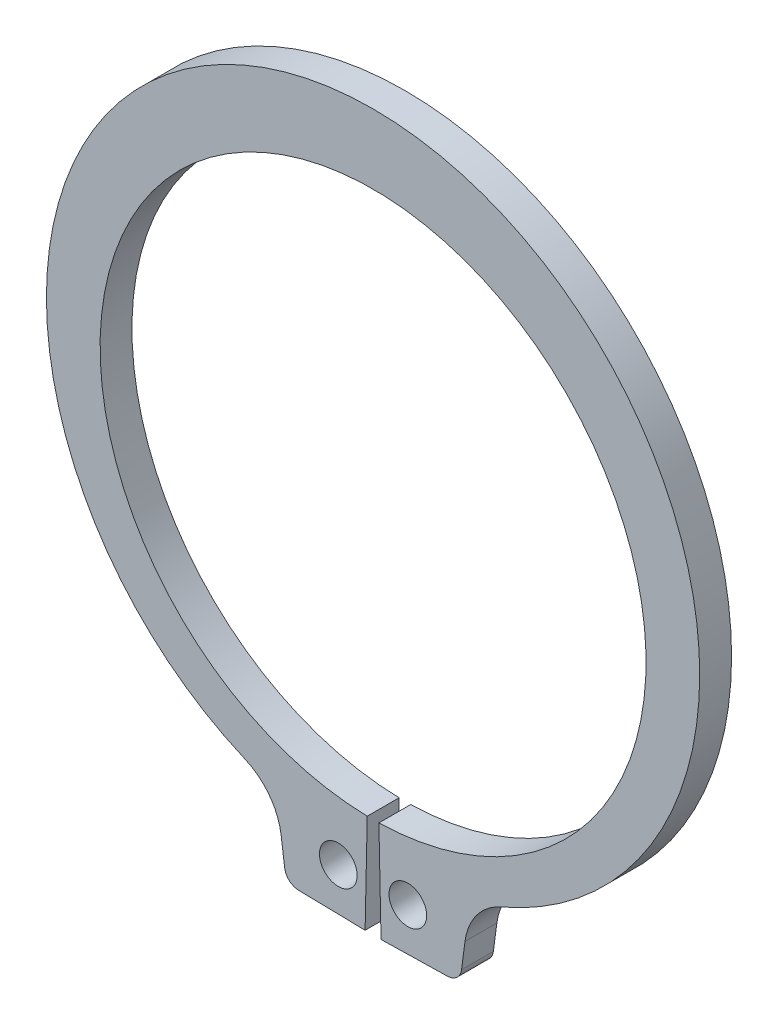
ISO-10303-21;
HEADER;
FILE_DESCRIPTION(('STEP AP214'),'2;1');
FILE_NAME('part.step','',(''),(''),'','','');
FILE_SCHEMA(('AUTOMOTIVE_DESIGN { 1 0 10303 214 1 1 1 1 }'));
ENDSEC;
DATA;
#1=APPLICATION_CONTEXT('core data for automotive mechanical design processes');
#2=APPLICATION_PROTOCOL_DEFINITION('international standard','automotive_design',2000,#1);
#3=PRODUCT_CONTEXT('',#1,'mechanical');
#4=PRODUCT('Part','Part','',(#3));
#5=PRODUCT_RELATED_PRODUCT_CATEGORY('part','',(#4));
#6=PRODUCT_DEFINITION_FORMATION('','',#4);
#7=PRODUCT_DEFINITION_CONTEXT('part definition',#1,'design');
#8=PRODUCT_DEFINITION('design','',#6,#7);
#9=PRODUCT_DEFINITION_SHAPE('','',#8);
#10=(LENGTH_UNIT() NAMED_UNIT(*) SI_UNIT(.MILLI.,.METRE.));
#11=(NAMED_UNIT(*) PLANE_ANGLE_UNIT() SI_UNIT($,.RADIAN.));
#12=(NAMED_UNIT(*) SI_UNIT($,.STERADIAN.) SOLID_ANGLE_UNIT());
#13=UNCERTAINTY_MEASURE_WITH_UNIT(LENGTH_MEASURE(1.E-05),#10,'distance_accuracy_value','');
#14=(GEOMETRIC_REPRESENTATION_CONTEXT(3) GLOBAL_UNCERTAINTY_ASSIGNED_CONTEXT((#13)) GLOBAL_UNIT_ASSIGNED_CONTEXT((#10,
#11,#12)) REPRESENTATION_CONTEXT('',''));
#15=CARTESIAN_POINT('',(0.,0.,0.));
#16=DIRECTION('',(0.,0.,1.));
#17=DIRECTION('',(1.,0.,0.));
#18=AXIS2_PLACEMENT_3D('',#15,#16,#17);
#19=CARTESIAN_POINT('',(0.530667533439555,1.0225945994856,-1.30171469428051));
#20=DIRECTION('',(0.,0.,1.));
#21=DIRECTION('',(1.,0.,0.));
#22=AXIS2_PLACEMENT_3D('',#19,#20,#21);
#23=CYLINDRICAL_SURFACE('',#22,9.425);
#24=CARTESIAN_POINT('',(0.530667533439555,1.0225945994856,-0.201714694280508));
#25=DIRECTION('',(0.,0.,-1.));
#26=DIRECTION('',(1.,0.,0.));
#27=AXIS2_PLACEMENT_3D('',#24,#25,#26);
#28=CIRCLE('',#27,9.425);
#29=CARTESIAN_POINT('',(0.329356853827904,-8.40025523537191,-0.201714694280508));
#30=VERTEX_POINT('',#29);
#31=CARTESIAN_POINT('',(0.731978213051206,-8.40025523537191,-0.201714694280508));
#32=VERTEX_POINT('',#31);
#33=EDGE_CURVE('E137',#30,#32,#28,.T.);
#34=ORIENTED_EDGE('',*,*,#33,.F.);
#35=DIRECTION('',(0.,0.,1.));
#36=VECTOR('',#35,1.);
#37=CARTESIAN_POINT('',(0.329356853827904,-8.40025523537191,-1.30171469428051));
#38=LINE('',#37,#36);
#39=CARTESIAN_POINT('',(0.329356853827904,-8.40025523537191,-1.30171469428051));
#40=VERTEX_POINT('',#39);
#41=EDGE_CURVE('E10',#40,#30,#38,.T.);
#42=ORIENTED_EDGE('',*,*,#41,.F.);
#43=CARTESIAN_POINT('',(0.530667533439555,1.0225945994856,-1.30171469428051));
#44=DIRECTION('',(0.,0.,-1.));
#45=DIRECTION('',(1.,0.,0.));
#46=AXIS2_PLACEMENT_3D('',#43,#44,#45);
#47=CIRCLE('',#46,9.425);
#48=CARTESIAN_POINT('',(0.731978213051206,-8.40025523537191,-1.30171469428051));
#49=VERTEX_POINT('',#48);
#50=EDGE_CURVE('E170',#40,#49,#47,.T.);
#51=ORIENTED_EDGE('',*,*,#50,.T.);
#52=DIRECTION('',(0.,0.,1.));
#53=VECTOR('',#52,1.);
#54=CARTESIAN_POINT('',(0.731978213051206,-8.40025523537191,-1.30171469428051));
#55=LINE('',#54,#53);
#56=EDGE_CURVE('E19',#49,#32,#55,.T.);
#57=ORIENTED_EDGE('',*,*,#56,.T.);
#58=EDGE_LOOP('',(#34,#42,#51,#57));
#59=FACE_BOUND('',#58,.T.);
#60=ADVANCED_FACE('F16',(#59),#23,.F.);
#61=CARTESIAN_POINT('',(0.329356853827904,-8.40025523537191,-1.30171469428051));
#62=DIRECTION('',(0.999771865767376,-0.0213592233009709,0.));
#63=DIRECTION('',(0.0213592233009709,0.999771865767376,0.));
#64=AXIS2_PLACEMENT_3D('',#61,#62,#63);
#65=PLANE('',#64);
#66=DIRECTION('',(0.0213592233009709,0.999771865767376,0.));
#67=VECTOR('',#66,1.);
#68=CARTESIAN_POINT('',(0.329356853827904,-8.40025523537191,-0.201714694280508));
#69=LINE('',#68,#67);
#70=CARTESIAN_POINT('',(0.255667533439555,-11.8494681722694,-0.201714694280508));
#71=VERTEX_POINT('',#70);
#72=EDGE_CURVE('E168',#71,#30,#69,.T.);
#73=ORIENTED_EDGE('',*,*,#72,.F.);
#74=DIRECTION('',(0.,0.,1.));
#75=VECTOR('',#74,1.);
#76=CARTESIAN_POINT('',(0.255667533439555,-11.8494681722694,-1.30171469428051));
#77=LINE('',#76,#75);
#78=CARTESIAN_POINT('',(0.255667533439555,-11.8494681722694,-1.30171469428051));
#79=VERTEX_POINT('',#78);
#80=EDGE_CURVE('E25',#79,#71,#77,.T.);
#81=ORIENTED_EDGE('',*,*,#80,.F.);
#82=DIRECTION('',(0.0213592233009709,0.999771865767376,0.));
#83=VECTOR('',#82,1.);
#84=CARTESIAN_POINT('',(0.329356853827904,-8.40025523537191,-1.30171469428051));
#85=LINE('',#84,#83);
#86=EDGE_CURVE('E127',#79,#40,#85,.T.);
#87=ORIENTED_EDGE('',*,*,#86,.T.);
#88=ORIENTED_EDGE('',*,*,#41,.T.);
#89=EDGE_LOOP('',(#73,#81,#87,#88));
#90=FACE_BOUND('',#89,.T.);
#91=ADVANCED_FACE('F190',(#90),#65,.T.);
#92=CARTESIAN_POINT('',(0.255667533439555,-11.8494681722694,-1.30171469428051));
#93=DIRECTION('',(-0.0213592233009728,-0.999771865767375,0.));
#94=DIRECTION('',(0.999771865767376,-0.0213592233009728,0.));
#95=AXIS2_PLACEMENT_3D('',#92,#93,#94);
#96=PLANE('',#95);
#97=DIRECTION('',(0.999771865767375,-0.0213592233009728,0.));
#98=VECTOR('',#97,1.);
#99=CARTESIAN_POINT('',(0.255667533439555,-11.8494681722694,-0.201714694280508));
#100=LINE('',#99,#98);
#101=CARTESIAN_POINT('',(-2.03810932903007,-11.8004637004637,-0.201714694280508));
#102=VERTEX_POINT('',#101);
#103=EDGE_CURVE('E114',#102,#71,#100,.T.);
#104=ORIENTED_EDGE('',*,*,#103,.F.);
#105=DIRECTION('',(0.,0.,1.));
#106=VECTOR('',#105,1.);
#107=CARTESIAN_POINT('',(-2.03810932903007,-11.8004637004637,-1.30171469428051));
#108=LINE('',#107,#106);
#109=CARTESIAN_POINT('',(-2.03810932903007,-11.8004637004637,-1.30171469428051));
#110=VERTEX_POINT('',#109);
#111=EDGE_CURVE('E109',#110,#102,#108,.T.);
#112=ORIENTED_EDGE('',*,*,#111,.F.);
#113=DIRECTION('',(0.999771865767375,-0.0213592233009728,0.));
#114=VECTOR('',#113,1.);
#115=CARTESIAN_POINT('',(0.255667533439555,-11.8494681722694,-1.30171469428051));
#116=LINE('',#115,#114);
#117=EDGE_CURVE('E112',#110,#79,#116,.T.);
#118=ORIENTED_EDGE('',*,*,#117,.T.);
#119=ORIENTED_EDGE('',*,*,#80,.T.);
#120=EDGE_LOOP('',(#104,#112,#118,#119));
#121=FACE_BOUND('',#120,.T.);
#122=ADVANCED_FACE('F111',(#121),#96,.T.);
#123=CARTESIAN_POINT('',(-2.02742971737958,-11.30057776758,-1.30171469428051));
#124=DIRECTION('',(0.,0.,1.));
#125=DIRECTION('',(1.,0.,0.));
#126=AXIS2_PLACEMENT_3D('',#123,#124,#125);
#127=CYLINDRICAL_SURFACE('',#126,0.499999999999997);
#128=CARTESIAN_POINT('',(-2.02742971737958,-11.30057776758,-0.201714694280508));
#129=DIRECTION('',(0.,0.,1.));
#130=DIRECTION('',(1.,0.,0.));
#131=AXIS2_PLACEMENT_3D('',#128,#129,#130);
#132=CIRCLE('',#131,0.499999999999997);
#133=CARTESIAN_POINT('',(-2.52315214806649,-11.36584086369,-0.201714694280508));
#134=VERTEX_POINT('',#133);
#135=EDGE_CURVE('E165',#134,#102,#132,.T.);
#136=ORIENTED_EDGE('',*,*,#135,.F.);
#137=DIRECTION('',(0.,0.,1.));
#138=VECTOR('',#137,1.);
#139=CARTESIAN_POINT('',(-2.52315214806649,-11.36584086369,-1.30171469428051));
#140=LINE('',#139,#138);
#141=CARTESIAN_POINT('',(-2.52315214806649,-11.36584086369,-1.30171469428051));
#142=VERTEX_POINT('',#141);
#143=EDGE_CURVE('E119',#142,#134,#140,.T.);
#144=ORIENTED_EDGE('',*,*,#143,.F.);
#145=CARTESIAN_POINT('',(-2.02742971737958,-11.30057776758,-1.30171469428051));
#146=DIRECTION('',(0.,0.,1.));
#147=DIRECTION('',(1.,0.,0.));
#148=AXIS2_PLACEMENT_3D('',#145,#146,#147);
#149=CIRCLE('',#148,0.499999999999997);
#150=EDGE_CURVE('E125',#142,#110,#149,.T.);
#151=ORIENTED_EDGE('',*,*,#150,.T.);
#152=ORIENTED_EDGE('',*,*,#111,.T.);
#153=EDGE_LOOP('',(#136,#144,#151,#152));
#154=FACE_BOUND('',#153,.T.);
#155=ADVANCED_FACE('F129',(#154),#127,.T.);
#156=CARTESIAN_POINT('',(-2.64280016057089,-10.4570239806303,-1.30171469428051));
#157=DIRECTION('',(-0.99144486137381,-0.130526192220052,0.));
#158=DIRECTION('',(0.130526192220052,-0.99144486137381,0.));
#159=AXIS2_PLACEMENT_3D('',#156,#157,#158);
#160=PLANE('',#159);
#161=DIRECTION('',(0.130526192220053,-0.99144486137381,0.));
#162=VECTOR('',#161,1.);
#163=CARTESIAN_POINT('',(-2.64280016057089,-10.4570239806303,-0.201714694280508));
#164=LINE('',#163,#162);
#165=CARTESIAN_POINT('',(-2.64280016057089,-10.4570239806303,-0.201714694280508));
#166=VERTEX_POINT('',#165);
#167=EDGE_CURVE('E162',#166,#134,#164,.T.);
#168=ORIENTED_EDGE('',*,*,#167,.F.);
#169=DIRECTION('',(0.,0.,1.));
#170=VECTOR('',#169,1.);
#171=CARTESIAN_POINT('',(-2.64280016057089,-10.4570239806303,-1.30171469428051));
#172=LINE('',#171,#170);
#173=CARTESIAN_POINT('',(-2.64280016057089,-10.4570239806303,-1.30171469428051));
#174=VERTEX_POINT('',#173);
#175=EDGE_CURVE('E174',#174,#166,#172,.T.);
#176=ORIENTED_EDGE('',*,*,#175,.F.);
#177=DIRECTION('',(0.130526192220053,-0.99144486137381,0.));
#178=VECTOR('',#177,1.);
#179=CARTESIAN_POINT('',(-2.64280016057089,-10.4570239806303,-1.30171469428051));
#180=LINE('',#179,#178);
#181=EDGE_CURVE('E130',#174,#142,#180,.T.);
#182=ORIENTED_EDGE('',*,*,#181,.T.);
#183=ORIENTED_EDGE('',*,*,#143,.T.);
#184=EDGE_LOOP('',(#168,#176,#182,#183));
#185=FACE_BOUND('',#184,.T.);
#186=ADVANCED_FACE('F204',(#185),#160,.T.);
#187=CARTESIAN_POINT('',(-4.7244894099482,-10.7310835695117,-1.30171469428051));
#188=DIRECTION('',(0.,0.,1.));
#189=DIRECTION('',(1.,0.,0.));
#190=AXIS2_PLACEMENT_3D('',#187,#188,#189);
#191=CYLINDRICAL_SURFACE('',#190,2.09965206385031);
#192=CARTESIAN_POINT('',(-4.7244894099482,-10.7310835695117,-0.201714694280508));
#193=DIRECTION('',(0.,0.,-1.));
#194=DIRECTION('',(1.,0.,0.));
#195=AXIS2_PLACEMENT_3D('',#192,#193,#194);
#196=CIRCLE('',#195,2.09965206385031);
#197=CARTESIAN_POINT('',(-3.89963502735555,-8.80024073884198,-0.201714694280508));
#198=VERTEX_POINT('',#197);
#199=EDGE_CURVE('E159',#198,#166,#196,.T.);
#200=ORIENTED_EDGE('',*,*,#199,.F.);
#201=DIRECTION('',(0.,0.,1.));
#202=VECTOR('',#201,1.);
#203=CARTESIAN_POINT('',(-3.89963502735555,-8.80024073884198,-1.30171469428051));
#204=LINE('',#203,#202);
#205=CARTESIAN_POINT('',(-3.89963502735555,-8.80024073884198,-1.30171469428051));
#206=VERTEX_POINT('',#205);
#207=EDGE_CURVE('E176',#206,#198,#204,.T.);
#208=ORIENTED_EDGE('',*,*,#207,.F.);
#209=CARTESIAN_POINT('',(-4.7244894099482,-10.7310835695117,-1.30171469428051));
#210=DIRECTION('',(0.,0.,-1.));
#211=DIRECTION('',(1.,0.,0.));
#212=AXIS2_PLACEMENT_3D('',#209,#210,#211);
#213=CIRCLE('',#212,2.09965206385031);
#214=EDGE_CURVE('E132',#206,#174,#213,.T.);
#215=ORIENTED_EDGE('',*,*,#214,.T.);
#216=ORIENTED_EDGE('',*,*,#175,.T.);
#217=EDGE_LOOP('',(#200,#208,#215,#216));
#218=FACE_BOUND('',#217,.T.);
#219=ADVANCED_FACE('F207',(#218),#191,.F.);
#220=CARTESIAN_POINT('',(0.530667533439555,1.57033874492281,-1.30171469428051));
#221=DIRECTION('',(0.,0.,1.));
#222=DIRECTION('',(1.,0.,0.));
#223=AXIS2_PLACEMENT_3D('',#220,#221,#222);
#224=CYLINDRICAL_SURFACE('',#223,11.2772558545628);
#225=CARTESIAN_POINT('',(0.530667533439555,1.57033874492281,-0.201714694280508));
#226=DIRECTION('',(0.,0.,1.));
#227=DIRECTION('',(1.,0.,0.));
#228=AXIS2_PLACEMENT_3D('',#225,#226,#227);
#229=CIRCLE('',#228,11.2772558545628);
#230=CARTESIAN_POINT('',(4.96097009423466,-8.80024073884198,-0.201714694280508));
#231=VERTEX_POINT('',#230);
#232=EDGE_CURVE('E156',#231,#198,#229,.T.);
#233=ORIENTED_EDGE('',*,*,#232,.F.);
#234=DIRECTION('',(0.,0.,1.));
#235=VECTOR('',#234,1.);
#236=CARTESIAN_POINT('',(4.96097009423466,-8.80024073884198,-1.30171469428051));
#237=LINE('',#236,#235);
#238=CARTESIAN_POINT('',(4.96097009423466,-8.80024073884198,-1.30171469428051));
#239=VERTEX_POINT('',#238);
#240=EDGE_CURVE('E178',#239,#231,#237,.T.);
#241=ORIENTED_EDGE('',*,*,#240,.F.);
#242=CARTESIAN_POINT('',(0.530667533439555,1.57033874492281,-1.30171469428051));
#243=DIRECTION('',(0.,0.,1.));
#244=DIRECTION('',(1.,0.,0.));
#245=AXIS2_PLACEMENT_3D('',#242,#243,#244);
#246=CIRCLE('',#245,11.2772558545628);
#247=EDGE_CURVE('E281',#239,#206,#246,.T.);
#248=ORIENTED_EDGE('',*,*,#247,.T.);
#249=ORIENTED_EDGE('',*,*,#207,.T.);
#250=EDGE_LOOP('',(#233,#241,#248,#249));
#251=FACE_BOUND('',#250,.T.);
#252=ADVANCED_FACE('F211',(#251),#224,.T.);
#253=CARTESIAN_POINT('',(5.78582447682731,-10.7310835695117,-1.30171469428051));
#254=DIRECTION('',(0.,0.,1.));
#255=DIRECTION('',(1.,0.,0.));
#256=AXIS2_PLACEMENT_3D('',#253,#254,#255);
#257=CYLINDRICAL_SURFACE('',#256,2.09965206385031);
#258=CARTESIAN_POINT('',(5.78582447682731,-10.7310835695117,-0.201714694280508));
#259=DIRECTION('',(0.,0.,-1.));
#260=DIRECTION('',(1.,0.,0.));
#261=AXIS2_PLACEMENT_3D('',#258,#259,#260);
#262=CIRCLE('',#261,2.09965206385031);
#263=CARTESIAN_POINT('',(3.70413522745,-10.4570239806303,-0.201714694280508));
#264=VERTEX_POINT('',#263);
#265=EDGE_CURVE('E153',#264,#231,#262,.T.);
#266=ORIENTED_EDGE('',*,*,#265,.F.);
#267=DIRECTION('',(0.,0.,1.));
#268=VECTOR('',#267,1.);
#269=CARTESIAN_POINT('',(3.70413522745,-10.4570239806303,-1.30171469428051));
#270=LINE('',#269,#268);
#271=CARTESIAN_POINT('',(3.70413522745,-10.4570239806303,-1.30171469428051));
#272=VERTEX_POINT('',#271);
#273=EDGE_CURVE('E180',#272,#264,#270,.T.);
#274=ORIENTED_EDGE('',*,*,#273,.F.);
#275=CARTESIAN_POINT('',(5.78582447682731,-10.7310835695117,-1.30171469428051));
#276=DIRECTION('',(0.,0.,-1.));
#277=DIRECTION('',(1.,0.,0.));
#278=AXIS2_PLACEMENT_3D('',#275,#276,#277);
#279=CIRCLE('',#278,2.09965206385031);
#280=EDGE_CURVE('E278',#272,#239,#279,.T.);
#281=ORIENTED_EDGE('',*,*,#280,.T.);
#282=ORIENTED_EDGE('',*,*,#240,.T.);
#283=EDGE_LOOP('',(#266,#274,#281,#282));
#284=FACE_BOUND('',#283,.T.);
#285=ADVANCED_FACE('F215',(#284),#257,.F.);
#286=CARTESIAN_POINT('',(3.70413522745,-10.4570239806303,-1.30171469428051));
#287=DIRECTION('',(0.99144486137381,-0.130526192220052,0.));
#288=DIRECTION('',(0.130526192220052,0.99144486137381,0.));
#289=AXIS2_PLACEMENT_3D('',#286,#287,#288);
#290=PLANE('',#289);
#291=DIRECTION('',(0.130526192220053,0.99144486137381,0.));
#292=VECTOR('',#291,1.);
#293=CARTESIAN_POINT('',(3.70413522745,-10.4570239806303,-0.201714694280508));
#294=LINE('',#293,#292);
#295=CARTESIAN_POINT('',(3.5844872149456,-11.36584086369,-0.201714694280508));
#296=VERTEX_POINT('',#295);
#297=EDGE_CURVE('E150',#296,#264,#294,.T.);
#298=ORIENTED_EDGE('',*,*,#297,.F.);
#299=DIRECTION('',(0.,0.,1.));
#300=VECTOR('',#299,1.);
#301=CARTESIAN_POINT('',(3.5844872149456,-11.36584086369,-1.30171469428051));
#302=LINE('',#301,#300);
#303=CARTESIAN_POINT('',(3.5844872149456,-11.36584086369,-1.30171469428051));
#304=VERTEX_POINT('',#303);
#305=EDGE_CURVE('E182',#304,#296,#302,.T.);
#306=ORIENTED_EDGE('',*,*,#305,.F.);
#307=DIRECTION('',(0.130526192220053,0.99144486137381,0.));
#308=VECTOR('',#307,1.);
#309=CARTESIAN_POINT('',(3.70413522745,-10.4570239806303,-1.30171469428051));
#310=LINE('',#309,#308);
#311=EDGE_CURVE('E275',#304,#272,#310,.T.);
#312=ORIENTED_EDGE('',*,*,#311,.T.);
#313=ORIENTED_EDGE('',*,*,#273,.T.);
#314=EDGE_LOOP('',(#298,#306,#312,#313));
#315=FACE_BOUND('',#314,.T.);
#316=ADVANCED_FACE('F219',(#315),#290,.T.);
#317=CARTESIAN_POINT('',(3.08876478425869,-11.30057776758,-1.30171469428051));
#318=DIRECTION('',(0.,0.,1.));
#319=DIRECTION('',(1.,0.,0.));
#320=AXIS2_PLACEMENT_3D('',#317,#318,#319);
#321=CYLINDRICAL_SURFACE('',#320,0.499999999999997);
#322=CARTESIAN_POINT('',(3.08876478425869,-11.30057776758,-0.201714694280508));
#323=DIRECTION('',(0.,0.,1.));
#324=DIRECTION('',(-1.,0.,0.));
#325=AXIS2_PLACEMENT_3D('',#322,#323,#324);
#326=CIRCLE('',#325,0.499999999999997);
#327=CARTESIAN_POINT('',(3.09944439590918,-11.8004637004637,-0.201714694280508));
#328=VERTEX_POINT('',#327);
#329=EDGE_CURVE('E147',#328,#296,#326,.T.);
#330=ORIENTED_EDGE('',*,*,#329,.F.);
#331=DIRECTION('',(0.,0.,1.));
#332=VECTOR('',#331,1.);
#333=CARTESIAN_POINT('',(3.09944439590918,-11.8004637004637,-1.30171469428051));
#334=LINE('',#333,#332);
#335=CARTESIAN_POINT('',(3.09944439590918,-11.8004637004637,-1.30171469428051));
#336=VERTEX_POINT('',#335);
#337=EDGE_CURVE('E184',#336,#328,#334,.T.);
#338=ORIENTED_EDGE('',*,*,#337,.F.);
#339=CARTESIAN_POINT('',(3.08876478425869,-11.30057776758,-1.30171469428051));
#340=DIRECTION('',(0.,0.,1.));
#341=DIRECTION('',(-1.,0.,0.));
#342=AXIS2_PLACEMENT_3D('',#339,#340,#341);
#343=CIRCLE('',#342,0.499999999999997);
#344=EDGE_CURVE('E272',#336,#304,#343,.T.);
#345=ORIENTED_EDGE('',*,*,#344,.T.);
#346=ORIENTED_EDGE('',*,*,#305,.T.);
#347=EDGE_LOOP('',(#330,#338,#345,#346));
#348=FACE_BOUND('',#347,.T.);
#349=ADVANCED_FACE('F223',(#348),#321,.T.);
#350=CARTESIAN_POINT('',(0.805667533439555,-11.8494681722694,-1.30171469428051));
#351=DIRECTION('',(0.0213592233009728,-0.999771865767375,0.));
#352=DIRECTION('',(0.999771865767376,0.0213592233009728,0.));
#353=AXIS2_PLACEMENT_3D('',#350,#351,#352);
#354=PLANE('',#353);
#355=DIRECTION('',(0.999771865767375,0.0213592233009728,0.));
#356=VECTOR('',#355,1.);
#357=CARTESIAN_POINT('',(0.805667533439555,-11.8494681722694,-0.201714694280508));
#358=LINE('',#357,#356);
#359=CARTESIAN_POINT('',(0.805667533439555,-11.8494681722694,-0.201714694280508));
#360=VERTEX_POINT('',#359);
#361=EDGE_CURVE('E144',#360,#328,#358,.T.);
#362=ORIENTED_EDGE('',*,*,#361,.F.);
#363=DIRECTION('',(0.,0.,1.));
#364=VECTOR('',#363,1.);
#365=CARTESIAN_POINT('',(0.805667533439555,-11.8494681722694,-1.30171469428051));
#366=LINE('',#365,#364);
#367=CARTESIAN_POINT('',(0.805667533439555,-11.8494681722694,-1.30171469428051));
#368=VERTEX_POINT('',#367);
#369=EDGE_CURVE('E185',#368,#360,#366,.T.);
#370=ORIENTED_EDGE('',*,*,#369,.F.);
#371=DIRECTION('',(0.999771865767375,0.0213592233009728,0.));
#372=VECTOR('',#371,1.);
#373=CARTESIAN_POINT('',(0.805667533439555,-11.8494681722694,-1.30171469428051));
#374=LINE('',#373,#372);
#375=EDGE_CURVE('E269',#368,#336,#374,.T.);
#376=ORIENTED_EDGE('',*,*,#375,.T.);
#377=ORIENTED_EDGE('',*,*,#337,.T.);
#378=EDGE_LOOP('',(#362,#370,#376,#377));
#379=FACE_BOUND('',#378,.T.);
#380=ADVANCED_FACE('F227',(#379),#354,.T.);
#381=CARTESIAN_POINT('',(0.731978213051206,-8.40025523537191,-1.30171469428051));
#382=DIRECTION('',(-0.999771865767376,-0.0213592233009709,0.));
#383=DIRECTION('',(0.0213592233009709,-0.999771865767376,0.));
#384=AXIS2_PLACEMENT_3D('',#381,#382,#383);
#385=PLANE('',#384);
#386=DIRECTION('',(0.0213592233009709,-0.999771865767376,0.));
#387=VECTOR('',#386,1.);
#388=CARTESIAN_POINT('',(0.731978213051206,-8.40025523537191,-0.201714694280508));
#389=LINE('',#388,#387);
#390=EDGE_CURVE('E140',#32,#360,#389,.T.);
#391=ORIENTED_EDGE('',*,*,#390,.F.);
#392=ORIENTED_EDGE('',*,*,#56,.F.);
#393=DIRECTION('',(0.0213592233009709,-0.999771865767376,0.));
#394=VECTOR('',#393,1.);
#395=CARTESIAN_POINT('',(0.731978213051206,-8.40025523537191,-1.30171469428051));
#396=LINE('',#395,#394);
#397=EDGE_CURVE('E267',#49,#368,#396,.T.);
#398=ORIENTED_EDGE('',*,*,#397,.T.);
#399=ORIENTED_EDGE('',*,*,#369,.T.);
#400=EDGE_LOOP('',(#391,#392,#398,#399));
#401=FACE_BOUND('',#400,.T.);
#402=ADVANCED_FACE('F187',(#401),#385,.T.);
#403=CARTESIAN_POINT('',(0.530667533439555,1.0225945994856,-1.30171469428051));
#404=DIRECTION('',(0.,0.,1.));
#405=DIRECTION('',(1.,0.,0.));
#406=AXIS2_PLACEMENT_3D('',#403,#404,#405);
#407=PLANE('',#406);
#408=CARTESIAN_POINT('',(-0.669332466560445,-10.3517803833431,-1.30171469428051));
#409=DIRECTION('',(0.,0.,1.));
#410=DIRECTION('',(1.,0.,0.));
#411=AXIS2_PLACEMENT_3D('',#408,#409,#410);
#412=CIRCLE('',#411,0.65);
#413=CARTESIAN_POINT('',(-0.0193324665604453,-10.3517803833431,-1.30171469428051));
#414=VERTEX_POINT('',#413);
#415=EDGE_CURVE('E254',#414,#414,#412,.T.);
#416=ORIENTED_EDGE('',*,*,#415,.T.);
#417=EDGE_LOOP('',(#416));
#418=FACE_BOUND('',#417,.T.);
#419=CARTESIAN_POINT('',(1.73066753343956,-10.3517803833431,-1.30171469428051));
#420=DIRECTION('',(0.,0.,1.));
#421=DIRECTION('',(1.,0.,0.));
#422=AXIS2_PLACEMENT_3D('',#419,#420,#421);
#423=CIRCLE('',#422,0.65);
#424=CARTESIAN_POINT('',(2.38066753343956,-10.3517803833431,-1.30171469428051));
#425=VERTEX_POINT('',#424);
#426=EDGE_CURVE('E141',#425,#425,#423,.T.);
#427=ORIENTED_EDGE('',*,*,#426,.T.);
#428=EDGE_LOOP('',(#427));
#429=FACE_BOUND('',#428,.T.);
#430=ORIENTED_EDGE('',*,*,#50,.F.);
#431=ORIENTED_EDGE('',*,*,#86,.F.);
#432=ORIENTED_EDGE('',*,*,#117,.F.);
#433=ORIENTED_EDGE('',*,*,#150,.F.);
#434=ORIENTED_EDGE('',*,*,#181,.F.);
#435=ORIENTED_EDGE('',*,*,#214,.F.);
#436=ORIENTED_EDGE('',*,*,#247,.F.);
#437=ORIENTED_EDGE('',*,*,#280,.F.);
#438=ORIENTED_EDGE('',*,*,#311,.F.);
#439=ORIENTED_EDGE('',*,*,#344,.F.);
#440=ORIENTED_EDGE('',*,*,#375,.F.);
#441=ORIENTED_EDGE('',*,*,#397,.F.);
#442=EDGE_LOOP('',(#430,#431,#432,#433,#434,#435,#436,#437,#438,#439,#440,#441));
#443=FACE_BOUND('',#442,.T.);
#444=ADVANCED_FACE('F123',(#418,#429,#443),#407,.F.);
#445=CARTESIAN_POINT('',(0.530667533439555,1.0225945994856,-0.201714694280508));
#446=DIRECTION('',(0.,0.,1.));
#447=DIRECTION('',(1.,0.,0.));
#448=AXIS2_PLACEMENT_3D('',#445,#446,#447);
#449=PLANE('',#448);
#450=CARTESIAN_POINT('',(-0.669332466560445,-10.3517803833431,-0.201714694280508));
#451=DIRECTION('',(0.,0.,1.));
#452=DIRECTION('',(1.,0.,0.));
#453=AXIS2_PLACEMENT_3D('',#450,#451,#452);
#454=CIRCLE('',#453,0.65);
#455=CARTESIAN_POINT('',(-0.0193324665604453,-10.3517803833431,-0.201714694280508));
#456=VERTEX_POINT('',#455);
#457=EDGE_CURVE('E257',#456,#456,#454,.T.);
#458=ORIENTED_EDGE('',*,*,#457,.F.);
#459=EDGE_LOOP('',(#458));
#460=FACE_BOUND('',#459,.T.);
#461=CARTESIAN_POINT('',(1.73066753343956,-10.3517803833431,-0.201714694280508));
#462=DIRECTION('',(0.,0.,1.));
#463=DIRECTION('',(1.,0.,0.));
#464=AXIS2_PLACEMENT_3D('',#461,#462,#463);
#465=CIRCLE('',#464,0.65);
#466=CARTESIAN_POINT('',(2.38066753343956,-10.3517803833431,-0.201714694280508));
#467=VERTEX_POINT('',#466);
#468=EDGE_CURVE('E259',#467,#467,#465,.T.);
#469=ORIENTED_EDGE('',*,*,#468,.F.);
#470=EDGE_LOOP('',(#469));
#471=FACE_BOUND('',#470,.T.);
#472=ORIENTED_EDGE('',*,*,#33,.T.);
#473=ORIENTED_EDGE('',*,*,#390,.T.);
#474=ORIENTED_EDGE('',*,*,#361,.T.);
#475=ORIENTED_EDGE('',*,*,#329,.T.);
#476=ORIENTED_EDGE('',*,*,#297,.T.);
#477=ORIENTED_EDGE('',*,*,#265,.T.);
#478=ORIENTED_EDGE('',*,*,#232,.T.);
#479=ORIENTED_EDGE('',*,*,#199,.T.);
#480=ORIENTED_EDGE('',*,*,#167,.T.);
#481=ORIENTED_EDGE('',*,*,#135,.T.);
#482=ORIENTED_EDGE('',*,*,#103,.T.);
#483=ORIENTED_EDGE('',*,*,#72,.T.);
#484=EDGE_LOOP('',(#472,#473,#474,#475,#476,#477,#478,#479,#480,#481,#482,#483));
#485=FACE_BOUND('',#484,.T.);
#486=ADVANCED_FACE('F189',(#460,#471,#485),#449,.T.);
#487=CARTESIAN_POINT('',(1.73066753343956,-10.3517803833431,-1.30171469428051));
#488=DIRECTION('',(0.,0.,1.));
#489=DIRECTION('',(1.,0.,0.));
#490=AXIS2_PLACEMENT_3D('',#487,#488,#489);
#491=CYLINDRICAL_SURFACE('',#490,0.65);
#492=ORIENTED_EDGE('',*,*,#426,.F.);
#493=EDGE_LOOP('',(#492));
#494=FACE_BOUND('',#493,.T.);
#495=ORIENTED_EDGE('',*,*,#468,.T.);
#496=EDGE_LOOP('',(#495));
#497=FACE_BOUND('',#496,.T.);
#498=ADVANCED_FACE('F239',(#494,#497),#491,.F.);
#499=CARTESIAN_POINT('',(-0.669332466560445,-10.3517803833431,-1.30171469428051));
#500=DIRECTION('',(0.,0.,1.));
#501=DIRECTION('',(1.,0.,0.));
#502=AXIS2_PLACEMENT_3D('',#499,#500,#501);
#503=CYLINDRICAL_SURFACE('',#502,0.65);
#504=ORIENTED_EDGE('',*,*,#415,.F.);
#505=EDGE_LOOP('',(#504));
#506=FACE_BOUND('',#505,.T.);
#507=ORIENTED_EDGE('',*,*,#457,.T.);
#508=EDGE_LOOP('',(#507));
#509=FACE_BOUND('',#508,.T.);
#510=ADVANCED_FACE('F246',(#506,#509),#503,.F.);
#511=CLOSED_SHELL('',(#60,#91,#122,#155,#186,#219,#252,#285,#316,#349,#380,#402,#444,#486,#498,#510));
#512=MANIFOLD_SOLID_BREP('B1',#511);
#513=ADVANCED_BREP_SHAPE_REPRESENTATION('',(#18,#512),#14);
#514=SHAPE_DEFINITION_REPRESENTATION(#9,#513);
ENDSEC;
END-ISO-10303-21;
